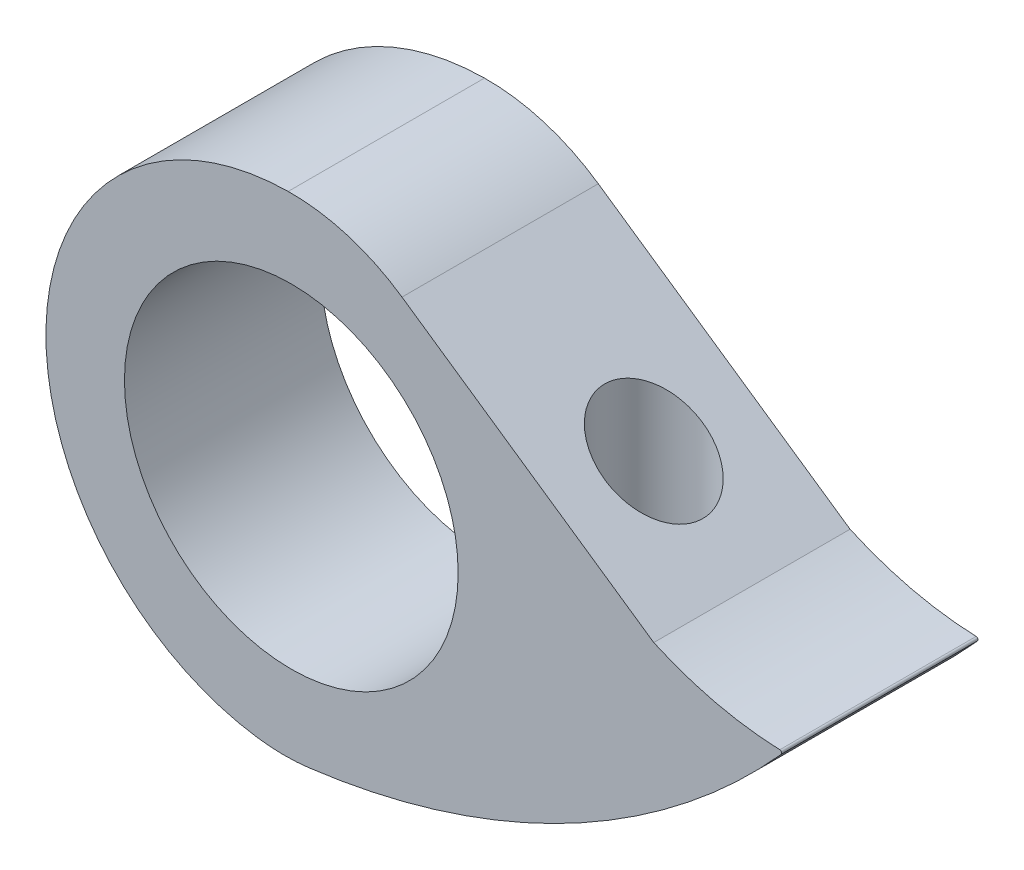
ISO-10303-21;
HEADER;
FILE_DESCRIPTION(('STEP AP214'),'2;1');
FILE_NAME('part.step','',(''),(''),'','','');
FILE_SCHEMA(('AUTOMOTIVE_DESIGN { 1 0 10303 214 1 1 1 1 }'));
ENDSEC;
DATA;
#1=APPLICATION_CONTEXT('core data for automotive mechanical design processes');
#2=APPLICATION_PROTOCOL_DEFINITION('international standard','automotive_design',2000,#1);
#3=PRODUCT_CONTEXT('',#1,'mechanical');
#4=PRODUCT('Part','Part','',(#3));
#5=PRODUCT_RELATED_PRODUCT_CATEGORY('part','',(#4));
#6=PRODUCT_DEFINITION_FORMATION('','',#4);
#7=PRODUCT_DEFINITION_CONTEXT('part definition',#1,'design');
#8=PRODUCT_DEFINITION('design','',#6,#7);
#9=PRODUCT_DEFINITION_SHAPE('','',#8);
#10=(LENGTH_UNIT() NAMED_UNIT(*) SI_UNIT(.MILLI.,.METRE.));
#11=(NAMED_UNIT(*) PLANE_ANGLE_UNIT() SI_UNIT($,.RADIAN.));
#12=(NAMED_UNIT(*) SI_UNIT($,.STERADIAN.) SOLID_ANGLE_UNIT());
#13=UNCERTAINTY_MEASURE_WITH_UNIT(LENGTH_MEASURE(1.E-05),#10,'distance_accuracy_value','');
#14=(GEOMETRIC_REPRESENTATION_CONTEXT(3) GLOBAL_UNCERTAINTY_ASSIGNED_CONTEXT((#13)) GLOBAL_UNIT_ASSIGNED_CONTEXT((#10,
#11,#12)) REPRESENTATION_CONTEXT('',''));
#15=CARTESIAN_POINT('',(0.,0.,0.));
#16=DIRECTION('',(0.,0.,1.));
#17=DIRECTION('',(1.,0.,0.));
#18=AXIS2_PLACEMENT_3D('',#15,#16,#17);
#19=CARTESIAN_POINT('',(0.,0.,2.54));
#20=DIRECTION('',(0.,0.,1.));
#21=DIRECTION('',(1.,0.,0.));
#22=AXIS2_PLACEMENT_3D('',#19,#20,#21);
#23=PLANE('',#22);
#24=CARTESIAN_POINT('',(-0.996123075015071,6.61092477175084,2.54));
#25=DIRECTION('',(0.,0.,1.));
#26=DIRECTION('',(1.,0.,0.));
#27=AXIS2_PLACEMENT_3D('',#24,#25,#26);
#28=CIRCLE('',#27,9.83649250591612);
#29=CARTESIAN_POINT('',(0.227934836249766,-3.14910940077202,2.54));
#30=VERTEX_POINT('',#29);
#31=CARTESIAN_POINT('',(6.33867594971169,0.056742283765677,2.54));
#32=VERTEX_POINT('',#31);
#33=EDGE_CURVE('E108',#30,#32,#28,.T.);
#34=ORIENTED_EDGE('',*,*,#33,.T.);
#35=CARTESIAN_POINT('',(6.31973587578636,0.0736666330796937,2.54));
#36=DIRECTION('',(0.,0.,1.));
#37=DIRECTION('',(1.,0.,0.));
#38=AXIS2_PLACEMENT_3D('',#35,#36,#37);
#39=CIRCLE('',#38,0.0254);
#40=CARTESIAN_POINT('',(6.32070884414423,0.0990479910531073,2.54));
#41=VERTEX_POINT('',#40);
#42=EDGE_CURVE('E11',#32,#41,#39,.T.);
#43=ORIENTED_EDGE('',*,*,#42,.T.);
#44=CARTESIAN_POINT('',(6.48740872195779,4.44766759279013,2.54));
#45=DIRECTION('',(0.,0.,-1.));
#46=DIRECTION('',(1.,0.,0.));
#47=AXIS2_PLACEMENT_3D('',#44,#45,#46);
#48=CIRCLE('',#47,4.35181356331754);
#49=CARTESIAN_POINT('',(4.68986737521937,0.484445873451135,2.54));
#50=VERTEX_POINT('',#49);
#51=EDGE_CURVE('E97',#41,#50,#48,.T.);
#52=ORIENTED_EDGE('',*,*,#51,.T.);
#53=DIRECTION('',(-0.823686250764749,0.567045818520083,0.));
#54=VECTOR('',#53,1.);
#55=CARTESIAN_POINT('',(1.03203612953401,3.0025866227865,2.54));
#56=LINE('',#55,#54);
#57=CARTESIAN_POINT('',(1.43218936010717,2.72711132384453,2.54));
#58=VERTEX_POINT('',#57);
#59=EDGE_CURVE('E103',#50,#58,#56,.T.);
#60=ORIENTED_EDGE('',*,*,#59,.T.);
#61=CARTESIAN_POINT('',(-0.00810701893383642,0.634948246902066,2.54));
#62=DIRECTION('',(0.,0.,1.));
#63=DIRECTION('',(1.,0.,0.));
#64=AXIS2_PLACEMENT_3D('',#61,#62,#63);
#65=CIRCLE('',#64,2.54);
#66=CARTESIAN_POINT('',(-0.0405350946691808,3.17474123451033,2.54));
#67=VERTEX_POINT('',#66);
#68=EDGE_CURVE('E150',#58,#67,#65,.T.);
#69=ORIENTED_EDGE('',*,*,#68,.T.);
#70=CARTESIAN_POINT('',(0.,0.,2.54));
#71=DIRECTION('',(0.,0.,1.));
#72=DIRECTION('',(1.,0.,0.));
#73=AXIS2_PLACEMENT_3D('',#70,#71,#72);
#74=CIRCLE('',#73,3.175);
#75=CARTESIAN_POINT('',(-0.440719995203147,-3.14426317057401,2.54));
#76=VERTEX_POINT('',#75);
#77=EDGE_CURVE('E134',#67,#76,#74,.T.);
#78=ORIENTED_EDGE('',*,*,#77,.T.);
#79=CARTESIAN_POINT('',(-0.0881439990406306,-0.628852634114808,2.54));
#80=DIRECTION('',(0.,0.,1.));
#81=DIRECTION('',(1.,0.,0.));
#82=AXIS2_PLACEMENT_3D('',#79,#80,#81);
#83=CIRCLE('',#82,2.54);
#84=EDGE_CURVE('E149',#76,#30,#83,.T.);
#85=ORIENTED_EDGE('',*,*,#84,.T.);
#86=EDGE_LOOP('',(#34,#43,#52,#60,#69,#78,#85));
#87=FACE_BOUND('',#86,.T.);
#88=CARTESIAN_POINT('',(0.,0.,2.54));
#89=DIRECTION('',(0.,0.,1.));
#90=DIRECTION('',(1.,0.,0.));
#91=AXIS2_PLACEMENT_3D('',#88,#89,#90);
#92=CIRCLE('',#91,2.159);
#93=CARTESIAN_POINT('',(2.159,0.,2.54));
#94=VERTEX_POINT('',#93);
#95=EDGE_CURVE('E128',#94,#94,#92,.T.);
#96=ORIENTED_EDGE('',*,*,#95,.F.);
#97=EDGE_LOOP('',(#96));
#98=FACE_BOUND('',#97,.T.);
#99=ADVANCED_FACE('F39',(#87,#98),#23,.T.);
#100=CARTESIAN_POINT('',(0.,0.,0.));
#101=DIRECTION('',(0.,0.,1.));
#102=DIRECTION('',(1.,0.,0.));
#103=AXIS2_PLACEMENT_3D('',#100,#101,#102);
#104=PLANE('',#103);
#105=CARTESIAN_POINT('',(6.48740872195779,4.44766759279013,0.));
#106=DIRECTION('',(0.,0.,-1.));
#107=DIRECTION('',(1.,0.,0.));
#108=AXIS2_PLACEMENT_3D('',#105,#106,#107);
#109=CIRCLE('',#108,4.35181356331754);
#110=CARTESIAN_POINT('',(6.32070884414423,0.0990479910531073,0.));
#111=VERTEX_POINT('',#110);
#112=CARTESIAN_POINT('',(4.68986737521937,0.484445873451135,0.));
#113=VERTEX_POINT('',#112);
#114=EDGE_CURVE('E111',#111,#113,#109,.T.);
#115=ORIENTED_EDGE('',*,*,#114,.F.);
#116=CARTESIAN_POINT('',(6.31973587578636,0.0736666330796937,0.));
#117=DIRECTION('',(0.,0.,1.));
#118=DIRECTION('',(1.,0.,0.));
#119=AXIS2_PLACEMENT_3D('',#116,#117,#118);
#120=CIRCLE('',#119,0.0254);
#121=CARTESIAN_POINT('',(6.33867594971169,0.056742283765677,0.));
#122=VERTEX_POINT('',#121);
#123=EDGE_CURVE('E65',#111,#122,#120,.F.);
#124=ORIENTED_EDGE('',*,*,#123,.T.);
#125=CARTESIAN_POINT('',(-0.996123075015071,6.61092477175084,0.));
#126=DIRECTION('',(0.,0.,1.));
#127=DIRECTION('',(1.,0.,0.));
#128=AXIS2_PLACEMENT_3D('',#125,#126,#127);
#129=CIRCLE('',#128,9.83649250591612);
#130=CARTESIAN_POINT('',(0.227934836249766,-3.14910940077202,0.));
#131=VERTEX_POINT('',#130);
#132=EDGE_CURVE('E129',#131,#122,#129,.T.);
#133=ORIENTED_EDGE('',*,*,#132,.F.);
#134=CARTESIAN_POINT('',(-0.0881439990406306,-0.628852634114808,0.));
#135=DIRECTION('',(0.,0.,1.));
#136=DIRECTION('',(1.,0.,0.));
#137=AXIS2_PLACEMENT_3D('',#134,#135,#136);
#138=CIRCLE('',#137,2.54);
#139=CARTESIAN_POINT('',(-0.440719995203147,-3.14426317057401,0.));
#140=VERTEX_POINT('',#139);
#141=EDGE_CURVE('E136',#131,#140,#138,.F.);
#142=ORIENTED_EDGE('',*,*,#141,.T.);
#143=CARTESIAN_POINT('',(0.,0.,0.));
#144=DIRECTION('',(0.,0.,1.));
#145=DIRECTION('',(1.,0.,0.));
#146=AXIS2_PLACEMENT_3D('',#143,#144,#145);
#147=CIRCLE('',#146,3.175);
#148=CARTESIAN_POINT('',(-0.0405350946691808,3.17474123451033,0.));
#149=VERTEX_POINT('',#148);
#150=EDGE_CURVE('E127',#149,#140,#147,.T.);
#151=ORIENTED_EDGE('',*,*,#150,.F.);
#152=CARTESIAN_POINT('',(-0.00810701893383642,0.634948246902066,0.));
#153=DIRECTION('',(0.,0.,1.));
#154=DIRECTION('',(1.,0.,0.));
#155=AXIS2_PLACEMENT_3D('',#152,#153,#154);
#156=CIRCLE('',#155,2.54);
#157=CARTESIAN_POINT('',(1.43218936010717,2.72711132384453,0.));
#158=VERTEX_POINT('',#157);
#159=EDGE_CURVE('E138',#149,#158,#156,.F.);
#160=ORIENTED_EDGE('',*,*,#159,.T.);
#161=DIRECTION('',(-0.823686250764749,0.567045818520083,0.));
#162=VECTOR('',#161,1.);
#163=CARTESIAN_POINT('',(1.03203612953401,3.0025866227865,0.));
#164=LINE('',#163,#162);
#165=EDGE_CURVE('E131',#113,#158,#164,.T.);
#166=ORIENTED_EDGE('',*,*,#165,.F.);
#167=EDGE_LOOP('',(#115,#124,#133,#142,#151,#160,#166));
#168=FACE_BOUND('',#167,.T.);
#169=CARTESIAN_POINT('',(0.,0.,0.));
#170=DIRECTION('',(0.,0.,1.));
#171=DIRECTION('',(1.,0.,0.));
#172=AXIS2_PLACEMENT_3D('',#169,#170,#171);
#173=CIRCLE('',#172,2.159);
#174=CARTESIAN_POINT('',(2.159,0.,0.));
#175=VERTEX_POINT('',#174);
#176=EDGE_CURVE('E168',#175,#175,#173,.T.);
#177=ORIENTED_EDGE('',*,*,#176,.T.);
#178=EDGE_LOOP('',(#177));
#179=FACE_BOUND('',#178,.T.);
#180=ADVANCED_FACE('F156',(#168,#179),#104,.F.);
#181=CARTESIAN_POINT('',(0.,0.,2.54));
#182=DIRECTION('',(0.,0.,-1.));
#183=DIRECTION('',(-1.,0.,0.));
#184=AXIS2_PLACEMENT_3D('',#181,#182,#183);
#185=CYLINDRICAL_SURFACE('',#184,3.175);
#186=ORIENTED_EDGE('',*,*,#150,.T.);
#187=DIRECTION('',(0.,0.,-1.));
#188=VECTOR('',#187,1.);
#189=CARTESIAN_POINT('',(-0.440719995203148,-3.14426317057401,2.54));
#190=LINE('',#189,#188);
#191=EDGE_CURVE('E144',#140,#76,#190,.F.);
#192=ORIENTED_EDGE('',*,*,#191,.T.);
#193=ORIENTED_EDGE('',*,*,#77,.F.);
#194=DIRECTION('',(0.,0.,-1.));
#195=VECTOR('',#194,1.);
#196=CARTESIAN_POINT('',(-0.0405350946691808,3.17474123451033,2.54));
#197=LINE('',#196,#195);
#198=EDGE_CURVE('E142',#67,#149,#197,.T.);
#199=ORIENTED_EDGE('',*,*,#198,.T.);
#200=EDGE_LOOP('',(#186,#192,#193,#199));
#201=FACE_BOUND('',#200,.T.);
#202=ADVANCED_FACE('F167',(#201),#185,.T.);
#203=CARTESIAN_POINT('',(-0.996123075015071,6.61092477175084,2.54));
#204=DIRECTION('',(0.,0.,-1.));
#205=DIRECTION('',(-1.,0.,0.));
#206=AXIS2_PLACEMENT_3D('',#203,#204,#205);
#207=CYLINDRICAL_SURFACE('',#206,9.83649250591612);
#208=CARTESIAN_POINT('',(3.41986737521937,-2.17859245972338,1.905));
#209=CARTESIAN_POINT('',(3.4597326607306,-2.15856300157361,1.90499880753022));
#210=CARTESIAN_POINT('',(3.49949782493445,-2.13824151815714,1.90123950482105));
#211=CARTESIAN_POINT('',(3.57770487113394,-2.09761316682134,1.88636178904549));
#212=CARTESIAN_POINT('',(3.6161441347891,-2.07730639758765,1.87522960389922));
#213=CARTESIAN_POINT('',(3.69061225661752,-2.03736305810279,1.84578300688087));
#214=CARTESIAN_POINT('',(3.72663886783283,-2.01772712072401,1.82746200587536));
#215=CARTESIAN_POINT('',(3.79509073650754,-1.97990662135042,1.78388435285154));
#216=CARTESIAN_POINT('',(3.82751750859326,-1.96172144986144,1.75863063341436));
#217=CARTESIAN_POINT('',(3.88608810962754,-1.92849443340102,1.70291889118447));
#218=CARTESIAN_POINT('',(3.9124564003613,-1.9133446713095,1.67276312279468));
#219=CARTESIAN_POINT('',(3.95950800915846,-1.88607745651731,1.6071030421793));
#220=CARTESIAN_POINT('',(3.9801977831666,-1.87395656169262,1.57160487548362));
#221=CARTESIAN_POINT('',(4.01232390251056,-1.85502740695194,1.50132280938691));
#222=CARTESIAN_POINT('',(4.02462255159995,-1.84772832160324,1.46706623944727));
#223=CARTESIAN_POINT('',(4.04322148376566,-1.83666136060135,1.39642656445459));
#224=CARTESIAN_POINT('',(4.04952870068819,-1.83288940310484,1.36004596942919));
#225=CARTESIAN_POINT('',(4.05531408389061,-1.82942923039915,1.2914200014219));
#226=CARTESIAN_POINT('',(4.05558364922703,-1.82926776672398,1.25926252776913));
#227=CARTESIAN_POINT('',(4.05128045770133,-1.83184188839408,1.19539583888556));
#228=CARTESIAN_POINT('',(4.04670881512461,-1.83457680708828,1.16368652220582));
#229=CARTESIAN_POINT('',(4.03323661954535,-1.84260605301423,1.10285623549331));
#230=CARTESIAN_POINT('',(4.02450954420173,-1.84779776652528,1.07368261405114));
#231=CARTESIAN_POINT('',(4.0031995762475,-1.86040985627614,1.01729968427345));
#232=CARTESIAN_POINT('',(3.9906159487819,-1.86783065725683,0.990090751525701));
#233=CARTESIAN_POINT('',(3.96111223399072,-1.88511625779195,0.936415532388659));
#234=CARTESIAN_POINT('',(3.94395871193688,-1.89511115402625,0.910120119855196));
#235=CARTESIAN_POINT('',(3.90640050525217,-1.91681336640098,0.860764681848722));
#236=CARTESIAN_POINT('',(3.88599437978171,-1.92852144125661,0.837706098781289));
#237=CARTESIAN_POINT('',(3.83975417139146,-1.95480155889516,0.792406998883563));
#238=CARTESIAN_POINT('',(3.81356013227632,-1.96954858387548,0.770635664432221));
#239=CARTESIAN_POINT('',(3.75850365781034,-2.0001787242841,0.731773771280354));
#240=CARTESIAN_POINT('',(3.72963983612682,-2.016062428974,0.71468566288741));
#241=CARTESIAN_POINT('',(3.6661301862389,-2.05056711925976,0.68349900433581));
#242=CARTESIAN_POINT('',(3.63121443156344,-2.06928052400613,0.670050203861121));
#243=CARTESIAN_POINT('',(3.55972014407264,-2.10701727746153,0.649475018136051));
#244=CARTESIAN_POINT('',(3.52314088185912,-2.12604075973847,0.642351434956142));
#245=CARTESIAN_POINT('',(3.44658072688357,-2.16523281393032,0.634315602589081));
#246=CARTESIAN_POINT('',(3.40654184595607,-2.18538754682473,0.633876735303389));
#247=CARTESIAN_POINT('',(3.32669410984712,-2.224901217224,0.640596494228126));
#248=CARTESIAN_POINT('',(3.2868852732444,-2.24426009120522,0.647755725683377));
#249=CARTESIAN_POINT('',(3.20926109836869,-2.28138404683594,0.669604790623687));
#250=CARTESIAN_POINT('',(3.17142672904666,-2.29916639849993,0.684196769625729));
#251=CARTESIAN_POINT('',(3.09858936780661,-2.33287332169681,0.72076109107571));
#252=CARTESIAN_POINT('',(3.06358505269167,-2.34879876298977,0.742729959394774));
#253=CARTESIAN_POINT('',(3.00047120925533,-2.37711862782953,0.791669099375953));
#254=CARTESIAN_POINT('',(2.97203698413438,-2.38969148534635,0.818116367008418));
#255=CARTESIAN_POINT('',(2.92008513488332,-2.4124173675629,0.876348119379204));
#256=CARTESIAN_POINT('',(2.89656415725315,-2.42257204344146,0.908128936848307));
#257=CARTESIAN_POINT('',(2.85756188382246,-2.43927441788563,0.972805107473797));
#258=CARTESIAN_POINT('',(2.84152584809659,-2.44607465959376,1.00530118742205));
#259=CARTESIAN_POINT('',(2.8151375273034,-2.45721089575223,1.07291734523383));
#260=CARTESIAN_POINT('',(2.80478236179748,-2.46154813908495,1.10803608301822));
#261=CARTESIAN_POINT('',(2.79077631464326,-2.46740278237498,1.17714491495473));
#262=CARTESIAN_POINT('',(2.78669478544271,-2.46910140910172,1.21103299075989));
#263=CARTESIAN_POINT('',(2.78402096356411,-2.47021494041842,1.27905935065316));
#264=CARTESIAN_POINT('',(2.78542739341473,-2.46963037648291,1.31319757466596));
#265=CARTESIAN_POINT('',(2.79354198634592,-2.46624666556222,1.37968040167599));
#266=CARTESIAN_POINT('',(2.8000904880491,-2.46351420801031,1.41204811943294));
#267=CARTESIAN_POINT('',(2.81802728266241,-2.45598956824011,1.47515780627494));
#268=CARTESIAN_POINT('',(2.82941564309746,-2.45119735728446,1.50589975267076));
#269=CARTESIAN_POINT('',(2.85679207079176,-2.43959193358891,1.56539639672547));
#270=CARTESIAN_POINT('',(2.87284387193112,-2.43275067402804,1.59411619773145));
#271=CARTESIAN_POINT('',(2.90889198180123,-2.41724371391032,1.64840663802364));
#272=CARTESIAN_POINT('',(2.92888883036192,-2.40857776365664,1.67397684554904));
#273=CARTESIAN_POINT('',(2.9733106466813,-2.38911954936107,1.72272057785128));
#274=CARTESIAN_POINT('',(2.99791363387001,-2.37823919470978,1.74569635407348));
#275=CARTESIAN_POINT('',(3.04996883368136,-2.35492925365795,1.78721349244222));
#276=CARTESIAN_POINT('',(3.07742268760158,-2.34249877398476,1.80575227960733));
#277=CARTESIAN_POINT('',(3.13670638089916,-2.31529796892533,1.83947377179077));
#278=CARTESIAN_POINT('',(3.16871053744137,-2.30041961746734,1.85426192217499));
#279=CARTESIAN_POINT('',(3.23418853676276,-2.26952321482948,1.87824576882723));
#280=CARTESIAN_POINT('',(3.26766114821378,-2.25350611177575,1.88744605803078));
#281=CARTESIAN_POINT('',(3.32106106924067,-2.2275696778454,1.89758395509311));
#282=CARTESIAN_POINT('',(3.34078355884524,-2.21790928614652,1.90036855919464));
#283=CARTESIAN_POINT('',(3.38030136667661,-2.19838735535614,1.90407686036928));
#284=CARTESIAN_POINT('',(3.40009668356822,-2.18852581993743,1.90500059139053));
#285=CARTESIAN_POINT('',(3.41986737521937,-2.17859245972338,1.905));
#286=B_SPLINE_CURVE_WITH_KNOTS('',3,(#208,#209,#210,#211,#212,#213,#214,#215,#216,#217,#218,
#219,#220,#221,#222,#223,#224,#225,#226,#227,#228,#229,#230,#231,#232,#233,#234,#235,#236,#237,
#238,#239,#240,#241,#242,#243,#244,#245,#246,#247,#248,#249,#250,#251,#252,#253,#254,#255,#256,
#257,#258,#259,#260,#261,#262,#263,#264,#265,#266,#267,#268,#269,#270,#271,#272,#273,#274,#275,
#276,#277,#278,#279,#280,#281,#282,#283,#284,#285),.UNSPECIFIED.,.T.,.F.,(4,2,2,2,2,2,2,2,2,2,2,
2,2,2,2,2,2,2,2,2,2,2,2,2,2,2,2,2,2,2,2,2,2,2,2,2,2,2,4),(0.,0.133762059914739,
0.267774686294664,0.401910434142621,0.535989528969474,0.663733906541717,0.791332443310245,
0.902042456908585,1.01262418985936,1.10861210369756,1.20457792910459,1.29684828523264,
1.38913623415636,1.48758590354848,1.58607930604204,1.69698329280611,1.80794519527312,
1.9329152711972,2.05794068126823,2.19178171456488,2.32563341009108,2.45776677531388,
2.58983799970787,2.71161964334389,2.8333178922595,2.94334347156649,3.05331321162368,
3.15533092964911,3.25732490170027,3.35627148499195,3.45521944881557,3.55558901127061,
3.65597231757137,3.76165424847119,3.86739736336355,3.98172360319859,4.095955745101,
4.16229458235756,4.22863220937523),.UNSPECIFIED.);
#287=CARTESIAN_POINT('',(3.41986737521937,-2.17859245972338,1.905));
#288=VERTEX_POINT('',#287);
#289=EDGE_CURVE('E171',#288,#288,#286,.T.);
#290=ORIENTED_EDGE('',*,*,#289,.T.);
#291=EDGE_LOOP('',(#290));
#292=FACE_BOUND('',#291,.T.);
#293=ORIENTED_EDGE('',*,*,#132,.T.);
#294=DIRECTION('',(0.,0.,-1.));
#295=VECTOR('',#294,1.);
#296=CARTESIAN_POINT('',(6.33867594971169,0.0567422837656779,2.54));
#297=LINE('',#296,#295);
#298=EDGE_CURVE('E48',#122,#32,#297,.F.);
#299=ORIENTED_EDGE('',*,*,#298,.T.);
#300=ORIENTED_EDGE('',*,*,#33,.F.);
#301=DIRECTION('',(0.,0.,-1.));
#302=VECTOR('',#301,1.);
#303=CARTESIAN_POINT('',(0.227934836249767,-3.14910940077202,2.54));
#304=LINE('',#303,#302);
#305=EDGE_CURVE('E116',#30,#131,#304,.T.);
#306=ORIENTED_EDGE('',*,*,#305,.T.);
#307=EDGE_LOOP('',(#293,#299,#300,#306));
#308=FACE_BOUND('',#307,.T.);
#309=ADVANCED_FACE('F185',(#292,#308),#207,.T.);
#310=CARTESIAN_POINT('',(6.48740872195779,4.44766759279013,2.54));
#311=DIRECTION('',(0.,0.,-1.));
#312=DIRECTION('',(-1.,0.,0.));
#313=AXIS2_PLACEMENT_3D('',#310,#311,#312);
#314=CYLINDRICAL_SURFACE('',#313,4.35181356331754);
#315=ORIENTED_EDGE('',*,*,#51,.F.);
#316=DIRECTION('',(0.,0.,-1.));
#317=VECTOR('',#316,1.);
#318=CARTESIAN_POINT('',(6.32070884414423,0.0990479910531073,2.54));
#319=LINE('',#318,#317);
#320=EDGE_CURVE('E155',#41,#111,#319,.T.);
#321=ORIENTED_EDGE('',*,*,#320,.T.);
#322=ORIENTED_EDGE('',*,*,#114,.T.);
#323=DIRECTION('',(0.,0.,-1.));
#324=VECTOR('',#323,1.);
#325=CARTESIAN_POINT('',(4.68986737521937,0.484445873451135,2.54));
#326=LINE('',#325,#324);
#327=EDGE_CURVE('E115',#50,#113,#326,.T.);
#328=ORIENTED_EDGE('',*,*,#327,.F.);
#329=EDGE_LOOP('',(#315,#321,#322,#328));
#330=FACE_BOUND('',#329,.T.);
#331=ADVANCED_FACE('F114',(#330),#314,.F.);
#332=CARTESIAN_POINT('',(1.03203612953401,3.0025866227865,2.54));
#333=DIRECTION('',(-0.567045818520083,-0.823686250764749,0.));
#334=DIRECTION('',(0.823686250764749,-0.567045818520083,0.));
#335=AXIS2_PLACEMENT_3D('',#332,#333,#334);
#336=PLANE('',#335);
#337=CARTESIAN_POINT('',(3.41986737521937,1.35874502419195,1.27));
#338=DIRECTION('',(-0.567045818520083,-0.823686250764749,0.));
#339=DIRECTION('',(-0.823686250764749,0.567045818520083,0.));
#340=AXIS2_PLACEMENT_3D('',#337,#338,#339);
#341=ELLIPSE('',#340,0.770924608017235,0.635000000000001);
#342=CARTESIAN_POINT('',(2.78486737521937,1.79589459956235,1.27));
#343=VERTEX_POINT('',#342);
#344=EDGE_CURVE('E43',#343,#343,#341,.T.);
#345=ORIENTED_EDGE('',*,*,#344,.T.);
#346=EDGE_LOOP('',(#345));
#347=FACE_BOUND('',#346,.T.);
#348=ORIENTED_EDGE('',*,*,#165,.T.);
#349=DIRECTION('',(0.,0.,-1.));
#350=VECTOR('',#349,1.);
#351=CARTESIAN_POINT('',(1.43218936010717,2.72711132384453,2.54));
#352=LINE('',#351,#350);
#353=EDGE_CURVE('E125',#158,#58,#352,.F.);
#354=ORIENTED_EDGE('',*,*,#353,.T.);
#355=ORIENTED_EDGE('',*,*,#59,.F.);
#356=ORIENTED_EDGE('',*,*,#327,.T.);
#357=EDGE_LOOP('',(#348,#354,#355,#356));
#358=FACE_BOUND('',#357,.T.);
#359=ADVANCED_FACE('F117',(#347,#358),#336,.F.);
#360=CARTESIAN_POINT('',(0.,0.,2.54));
#361=DIRECTION('',(0.,0.,-1.));
#362=DIRECTION('',(-1.,0.,0.));
#363=AXIS2_PLACEMENT_3D('',#360,#361,#362);
#364=CYLINDRICAL_SURFACE('',#363,2.159);
#365=ORIENTED_EDGE('',*,*,#95,.T.);
#366=EDGE_LOOP('',(#365));
#367=FACE_BOUND('',#366,.T.);
#368=ORIENTED_EDGE('',*,*,#176,.F.);
#369=EDGE_LOOP('',(#368));
#370=FACE_BOUND('',#369,.T.);
#371=ADVANCED_FACE('F192',(#367,#370),#364,.F.);
#372=CARTESIAN_POINT('',(-0.0881439990406306,-0.628852634114808,2.54));
#373=DIRECTION('',(0.,0.,-1.));
#374=DIRECTION('',(-1.,0.,0.));
#375=AXIS2_PLACEMENT_3D('',#372,#373,#374);
#376=CYLINDRICAL_SURFACE('',#375,2.54);
#377=ORIENTED_EDGE('',*,*,#84,.F.);
#378=ORIENTED_EDGE('',*,*,#191,.F.);
#379=ORIENTED_EDGE('',*,*,#141,.F.);
#380=ORIENTED_EDGE('',*,*,#305,.F.);
#381=EDGE_LOOP('',(#377,#378,#379,#380));
#382=FACE_BOUND('',#381,.T.);
#383=ADVANCED_FACE('F194',(#382),#376,.T.);
#384=CARTESIAN_POINT('',(-0.00810701893383642,0.634948246902066,2.54));
#385=DIRECTION('',(0.,0.,-1.));
#386=DIRECTION('',(-1.,0.,0.));
#387=AXIS2_PLACEMENT_3D('',#384,#385,#386);
#388=CYLINDRICAL_SURFACE('',#387,2.54);
#389=ORIENTED_EDGE('',*,*,#68,.F.);
#390=ORIENTED_EDGE('',*,*,#353,.F.);
#391=ORIENTED_EDGE('',*,*,#159,.F.);
#392=ORIENTED_EDGE('',*,*,#198,.F.);
#393=EDGE_LOOP('',(#389,#390,#391,#392));
#394=FACE_BOUND('',#393,.T.);
#395=ADVANCED_FACE('F159',(#394),#388,.T.);
#396=CARTESIAN_POINT('',(6.31973587578636,0.0736666330796937,2.54));
#397=DIRECTION('',(0.,0.,1.));
#398=DIRECTION('',(1.,0.,0.));
#399=AXIS2_PLACEMENT_3D('',#396,#397,#398);
#400=CYLINDRICAL_SURFACE('',#399,0.0254);
#401=ORIENTED_EDGE('',*,*,#42,.F.);
#402=ORIENTED_EDGE('',*,*,#298,.F.);
#403=ORIENTED_EDGE('',*,*,#123,.F.);
#404=ORIENTED_EDGE('',*,*,#320,.F.);
#405=EDGE_LOOP('',(#401,#402,#403,#404));
#406=FACE_BOUND('',#405,.T.);
#407=ADVANCED_FACE('F41',(#406),#400,.T.);
#408=CARTESIAN_POINT('',(3.41986737521937,-3.16885263411481,1.27));
#409=DIRECTION('',(0.,1.,0.));
#410=DIRECTION('',(0.,0.,1.));
#411=AXIS2_PLACEMENT_3D('',#408,#409,#410);
#412=CYLINDRICAL_SURFACE('',#411,0.635000000000001);
#413=ORIENTED_EDGE('',*,*,#344,.F.);
#414=EDGE_LOOP('',(#413));
#415=FACE_BOUND('',#414,.T.);
#416=ORIENTED_EDGE('',*,*,#289,.F.);
#417=EDGE_LOOP('',(#416));
#418=FACE_BOUND('',#417,.T.);
#419=ADVANCED_FACE('F188',(#415,#418),#412,.F.);
#420=CLOSED_SHELL('',(#99,#180,#202,#309,#331,#359,#371,#383,#395,#407,#419));
#421=MANIFOLD_SOLID_BREP('B2',#420);
#422=ADVANCED_BREP_SHAPE_REPRESENTATION('',(#18,#421),#14);
#423=SHAPE_DEFINITION_REPRESENTATION(#9,#422);
ENDSEC;
END-ISO-10303-21;
